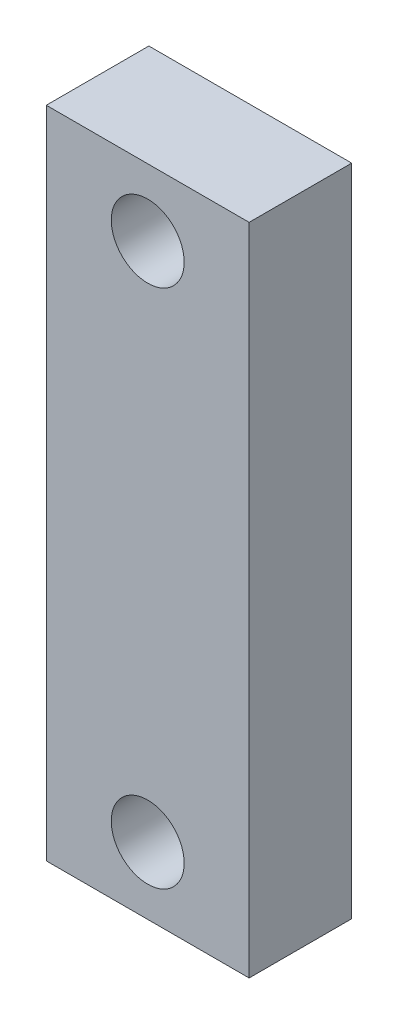
ISO-10303-21;
HEADER;
FILE_DESCRIPTION(('STEP AP214'),'2;1');
FILE_NAME('part.step','',(''),(''),'','','');
FILE_SCHEMA(('AUTOMOTIVE_DESIGN { 1 0 10303 214 1 1 1 1 }'));
ENDSEC;
DATA;
#1=APPLICATION_CONTEXT('core data for automotive mechanical design processes');
#2=APPLICATION_PROTOCOL_DEFINITION('international standard','automotive_design',2000,#1);
#3=PRODUCT_CONTEXT('',#1,'mechanical');
#4=PRODUCT('Part','Part','',(#3));
#5=PRODUCT_RELATED_PRODUCT_CATEGORY('part','',(#4));
#6=PRODUCT_DEFINITION_FORMATION('','',#4);
#7=PRODUCT_DEFINITION_CONTEXT('part definition',#1,'design');
#8=PRODUCT_DEFINITION('design','',#6,#7);
#9=PRODUCT_DEFINITION_SHAPE('','',#8);
#10=(LENGTH_UNIT() NAMED_UNIT(*) SI_UNIT(.MILLI.,.METRE.));
#11=(NAMED_UNIT(*) PLANE_ANGLE_UNIT() SI_UNIT($,.RADIAN.));
#12=(NAMED_UNIT(*) SI_UNIT($,.STERADIAN.) SOLID_ANGLE_UNIT());
#13=UNCERTAINTY_MEASURE_WITH_UNIT(LENGTH_MEASURE(1.E-05),#10,'distance_accuracy_value','');
#14=(GEOMETRIC_REPRESENTATION_CONTEXT(3) GLOBAL_UNCERTAINTY_ASSIGNED_CONTEXT((#13)) GLOBAL_UNIT_ASSIGNED_CONTEXT((#10,
#11,#12)) REPRESENTATION_CONTEXT('',''));
#15=CARTESIAN_POINT('',(0.,0.,0.));
#16=DIRECTION('',(0.,0.,1.));
#17=DIRECTION('',(1.,0.,0.));
#18=AXIS2_PLACEMENT_3D('',#15,#16,#17);
#19=CARTESIAN_POINT('',(0.,0.,13.4));
#20=DIRECTION('',(1.,0.,0.));
#21=DIRECTION('',(0.,0.,-1.));
#22=AXIS2_PLACEMENT_3D('',#19,#20,#21);
#23=PLANE('',#22);
#24=DIRECTION('',(0.,-1.,0.));
#25=VECTOR('',#24,1.);
#26=CARTESIAN_POINT('',(0.,0.,0.));
#27=LINE('',#26,#25);
#28=CARTESIAN_POINT('',(0.,85.5,0.));
#29=VERTEX_POINT('',#28);
#30=CARTESIAN_POINT('',(0.,0.,0.));
#31=VERTEX_POINT('',#30);
#32=EDGE_CURVE('E99',#29,#31,#27,.T.);
#33=ORIENTED_EDGE('',*,*,#32,.T.);
#34=DIRECTION('',(0.,0.,-1.));
#35=VECTOR('',#34,1.);
#36=CARTESIAN_POINT('',(0.,0.,13.4));
#37=LINE('',#36,#35);
#38=CARTESIAN_POINT('',(0.,0.,13.4));
#39=VERTEX_POINT('',#38);
#40=EDGE_CURVE('E11',#39,#31,#37,.T.);
#41=ORIENTED_EDGE('',*,*,#40,.F.);
#42=DIRECTION('',(0.,-1.,0.));
#43=VECTOR('',#42,1.);
#44=CARTESIAN_POINT('',(0.,0.,13.4));
#45=LINE('',#44,#43);
#46=CARTESIAN_POINT('',(0.,85.5,13.4));
#47=VERTEX_POINT('',#46);
#48=EDGE_CURVE('E87',#47,#39,#45,.T.);
#49=ORIENTED_EDGE('',*,*,#48,.F.);
#50=DIRECTION('',(0.,0.,-1.));
#51=VECTOR('',#50,1.);
#52=CARTESIAN_POINT('',(0.,85.5,13.4));
#53=LINE('',#52,#51);
#54=EDGE_CURVE('E95',#47,#29,#53,.T.);
#55=ORIENTED_EDGE('',*,*,#54,.T.);
#56=EDGE_LOOP('',(#33,#41,#49,#55));
#57=FACE_BOUND('',#56,.T.);
#58=ADVANCED_FACE('F36',(#57),#23,.F.);
#59=CARTESIAN_POINT('',(0.,0.,13.4));
#60=DIRECTION('',(0.,1.,0.));
#61=DIRECTION('',(0.,0.,1.));
#62=AXIS2_PLACEMENT_3D('',#59,#60,#61);
#63=PLANE('',#62);
#64=DIRECTION('',(1.,0.,0.));
#65=VECTOR('',#64,1.);
#66=CARTESIAN_POINT('',(0.,0.,0.));
#67=LINE('',#66,#65);
#68=CARTESIAN_POINT('',(26.5,0.,0.));
#69=VERTEX_POINT('',#68);
#70=EDGE_CURVE('E91',#31,#69,#67,.T.);
#71=ORIENTED_EDGE('',*,*,#70,.T.);
#72=DIRECTION('',(0.,0.,-1.));
#73=VECTOR('',#72,1.);
#74=CARTESIAN_POINT('',(26.5,0.,13.4));
#75=LINE('',#74,#73);
#76=CARTESIAN_POINT('',(26.5,0.,13.4));
#77=VERTEX_POINT('',#76);
#78=EDGE_CURVE('E44',#77,#69,#75,.T.);
#79=ORIENTED_EDGE('',*,*,#78,.F.);
#80=DIRECTION('',(1.,0.,0.));
#81=VECTOR('',#80,1.);
#82=CARTESIAN_POINT('',(0.,0.,13.4));
#83=LINE('',#82,#81);
#84=EDGE_CURVE('E82',#39,#77,#83,.T.);
#85=ORIENTED_EDGE('',*,*,#84,.F.);
#86=ORIENTED_EDGE('',*,*,#40,.T.);
#87=EDGE_LOOP('',(#71,#79,#85,#86));
#88=FACE_BOUND('',#87,.T.);
#89=ADVANCED_FACE('F90',(#88),#63,.F.);
#90=CARTESIAN_POINT('',(26.5,0.,13.4));
#91=DIRECTION('',(-1.,0.,0.));
#92=DIRECTION('',(0.,0.,1.));
#93=AXIS2_PLACEMENT_3D('',#90,#91,#92);
#94=PLANE('',#93);
#95=DIRECTION('',(0.,1.,0.));
#96=VECTOR('',#95,1.);
#97=CARTESIAN_POINT('',(26.5,0.,0.));
#98=LINE('',#97,#96);
#99=CARTESIAN_POINT('',(26.5,85.5,0.));
#100=VERTEX_POINT('',#99);
#101=EDGE_CURVE('E69',#69,#100,#98,.T.);
#102=ORIENTED_EDGE('',*,*,#101,.T.);
#103=DIRECTION('',(0.,0.,-1.));
#104=VECTOR('',#103,1.);
#105=CARTESIAN_POINT('',(26.5,85.5,13.4));
#106=LINE('',#105,#104);
#107=CARTESIAN_POINT('',(26.5,85.5,13.4));
#108=VERTEX_POINT('',#107);
#109=EDGE_CURVE('E92',#108,#100,#106,.T.);
#110=ORIENTED_EDGE('',*,*,#109,.F.);
#111=DIRECTION('',(0.,1.,0.));
#112=VECTOR('',#111,1.);
#113=CARTESIAN_POINT('',(26.5,0.,13.4));
#114=LINE('',#113,#112);
#115=EDGE_CURVE('E85',#77,#108,#114,.T.);
#116=ORIENTED_EDGE('',*,*,#115,.F.);
#117=ORIENTED_EDGE('',*,*,#78,.T.);
#118=EDGE_LOOP('',(#102,#110,#116,#117));
#119=FACE_BOUND('',#118,.T.);
#120=ADVANCED_FACE('F93',(#119),#94,.F.);
#121=CARTESIAN_POINT('',(0.,85.5,13.4));
#122=DIRECTION('',(0.,-1.,0.));
#123=DIRECTION('',(0.,0.,-1.));
#124=AXIS2_PLACEMENT_3D('',#121,#122,#123);
#125=PLANE('',#124);
#126=DIRECTION('',(-1.,0.,0.));
#127=VECTOR('',#126,1.);
#128=CARTESIAN_POINT('',(0.,85.5,0.));
#129=LINE('',#128,#127);
#130=EDGE_CURVE('E75',#100,#29,#129,.T.);
#131=ORIENTED_EDGE('',*,*,#130,.T.);
#132=ORIENTED_EDGE('',*,*,#54,.F.);
#133=DIRECTION('',(-1.,0.,0.));
#134=VECTOR('',#133,1.);
#135=CARTESIAN_POINT('',(0.,85.5,13.4));
#136=LINE('',#135,#134);
#137=EDGE_CURVE('E52',#108,#47,#136,.T.);
#138=ORIENTED_EDGE('',*,*,#137,.F.);
#139=ORIENTED_EDGE('',*,*,#109,.T.);
#140=EDGE_LOOP('',(#131,#132,#138,#139));
#141=FACE_BOUND('',#140,.T.);
#142=ADVANCED_FACE('F107',(#141),#125,.F.);
#143=CARTESIAN_POINT('',(0.,0.,13.4));
#144=DIRECTION('',(0.,0.,-1.));
#145=DIRECTION('',(-1.,0.,0.));
#146=AXIS2_PLACEMENT_3D('',#143,#144,#145);
#147=PLANE('',#146);
#148=CARTESIAN_POINT('',(13.25,8.75,13.4));
#149=DIRECTION('',(0.,0.,1.));
#150=DIRECTION('',(1.,0.,0.));
#151=AXIS2_PLACEMENT_3D('',#148,#149,#150);
#152=CIRCLE('',#151,4.7625);
#153=CARTESIAN_POINT('',(18.0125,8.75,13.4));
#154=VERTEX_POINT('',#153);
#155=EDGE_CURVE('E116',#154,#154,#152,.T.);
#156=ORIENTED_EDGE('',*,*,#155,.F.);
#157=EDGE_LOOP('',(#156));
#158=FACE_BOUND('',#157,.T.);
#159=CARTESIAN_POINT('',(13.25,76.75,13.4));
#160=DIRECTION('',(0.,0.,1.));
#161=DIRECTION('',(1.,0.,0.));
#162=AXIS2_PLACEMENT_3D('',#159,#160,#161);
#163=CIRCLE('',#162,4.7625);
#164=CARTESIAN_POINT('',(18.0125,76.75,13.4));
#165=VERTEX_POINT('',#164);
#166=EDGE_CURVE('E113',#165,#165,#163,.T.);
#167=ORIENTED_EDGE('',*,*,#166,.F.);
#168=EDGE_LOOP('',(#167));
#169=FACE_BOUND('',#168,.T.);
#170=ORIENTED_EDGE('',*,*,#48,.T.);
#171=ORIENTED_EDGE('',*,*,#84,.T.);
#172=ORIENTED_EDGE('',*,*,#115,.T.);
#173=ORIENTED_EDGE('',*,*,#137,.T.);
#174=EDGE_LOOP('',(#170,#171,#172,#173));
#175=FACE_BOUND('',#174,.T.);
#176=ADVANCED_FACE('F83',(#158,#169,#175),#147,.F.);
#177=CARTESIAN_POINT('',(0.,0.,0.));
#178=DIRECTION('',(0.,0.,-1.));
#179=DIRECTION('',(-1.,0.,0.));
#180=AXIS2_PLACEMENT_3D('',#177,#178,#179);
#181=PLANE('',#180);
#182=CARTESIAN_POINT('',(13.25,8.75,0.));
#183=DIRECTION('',(0.,0.,-1.));
#184=DIRECTION('',(-1.,0.,0.));
#185=AXIS2_PLACEMENT_3D('',#182,#183,#184);
#186=CIRCLE('',#185,4.7625);
#187=CARTESIAN_POINT('',(18.0125,8.75,0.));
#188=VERTEX_POINT('',#187);
#189=EDGE_CURVE('E102',#188,#188,#186,.F.);
#190=ORIENTED_EDGE('',*,*,#189,.T.);
#191=EDGE_LOOP('',(#190));
#192=FACE_BOUND('',#191,.T.);
#193=CARTESIAN_POINT('',(13.25,76.75,0.));
#194=DIRECTION('',(0.,0.,-1.));
#195=DIRECTION('',(-1.,0.,0.));
#196=AXIS2_PLACEMENT_3D('',#193,#194,#195);
#197=CIRCLE('',#196,4.7625);
#198=CARTESIAN_POINT('',(18.0125,76.75,0.));
#199=VERTEX_POINT('',#198);
#200=EDGE_CURVE('E117',#199,#199,#197,.F.);
#201=ORIENTED_EDGE('',*,*,#200,.T.);
#202=EDGE_LOOP('',(#201));
#203=FACE_BOUND('',#202,.T.);
#204=ORIENTED_EDGE('',*,*,#32,.F.);
#205=ORIENTED_EDGE('',*,*,#130,.F.);
#206=ORIENTED_EDGE('',*,*,#101,.F.);
#207=ORIENTED_EDGE('',*,*,#70,.F.);
#208=EDGE_LOOP('',(#204,#205,#206,#207));
#209=FACE_BOUND('',#208,.T.);
#210=ADVANCED_FACE('F110',(#192,#203,#209),#181,.T.);
#211=CARTESIAN_POINT('',(13.25,76.75,-13.4703841816037));
#212=DIRECTION('',(0.,0.,1.));
#213=DIRECTION('',(1.,0.,0.));
#214=AXIS2_PLACEMENT_3D('',#211,#212,#213);
#215=CYLINDRICAL_SURFACE('',#214,4.7625);
#216=CARTESIAN_POINT('',(18.0125,76.75,13.4));
#217=CARTESIAN_POINT('',(18.0125,76.75,13.2604166666667));
#218=CARTESIAN_POINT('',(18.0125,76.75,13.1208333333333));
#219=CARTESIAN_POINT('',(18.0125,76.75,12.8416666666667));
#220=CARTESIAN_POINT('',(18.0125,76.75,12.7020833333333));
#221=CARTESIAN_POINT('',(18.0125,76.75,12.4229166666667));
#222=CARTESIAN_POINT('',(18.0125,76.75,12.2833333333333));
#223=CARTESIAN_POINT('',(18.0125,76.75,12.0041666666667));
#224=CARTESIAN_POINT('',(18.0125,76.75,11.8645833333333));
#225=CARTESIAN_POINT('',(18.0125,76.75,11.5854166666667));
#226=CARTESIAN_POINT('',(18.0125,76.75,11.4458333333333));
#227=CARTESIAN_POINT('',(18.0125,76.75,11.1666666666667));
#228=CARTESIAN_POINT('',(18.0125,76.75,11.0270833333333));
#229=CARTESIAN_POINT('',(18.0125,76.75,10.7479166666667));
#230=CARTESIAN_POINT('',(18.0125,76.75,10.6083333333333));
#231=CARTESIAN_POINT('',(18.0125,76.75,10.3291666666667));
#232=CARTESIAN_POINT('',(18.0125,76.75,10.1895833333333));
#233=CARTESIAN_POINT('',(18.0125,76.75,9.91041666666666));
#234=CARTESIAN_POINT('',(18.0125,76.75,9.77083333333333));
#235=CARTESIAN_POINT('',(18.0125,76.75,9.49166666666666));
#236=CARTESIAN_POINT('',(18.0125,76.75,9.35208333333333));
#237=CARTESIAN_POINT('',(18.0125,76.75,9.07291666666666));
#238=CARTESIAN_POINT('',(18.0125,76.75,8.93333333333333));
#239=CARTESIAN_POINT('',(18.0125,76.75,8.65416666666667));
#240=CARTESIAN_POINT('',(18.0125,76.75,8.51458333333333));
#241=CARTESIAN_POINT('',(18.0125,76.75,8.23541666666666));
#242=CARTESIAN_POINT('',(18.0125,76.75,8.09583333333333));
#243=CARTESIAN_POINT('',(18.0125,76.75,7.81666666666666));
#244=CARTESIAN_POINT('',(18.0125,76.75,7.67708333333333));
#245=CARTESIAN_POINT('',(18.0125,76.75,7.39791666666666));
#246=CARTESIAN_POINT('',(18.0125,76.75,7.25833333333333));
#247=CARTESIAN_POINT('',(18.0125,76.75,6.97916666666667));
#248=CARTESIAN_POINT('',(18.0125,76.75,6.83958333333333));
#249=CARTESIAN_POINT('',(18.0125,76.75,6.56041666666667));
#250=CARTESIAN_POINT('',(18.0125,76.75,6.42083333333333));
#251=CARTESIAN_POINT('',(18.0125,76.75,6.14166666666666));
#252=CARTESIAN_POINT('',(18.0125,76.75,6.00208333333333));
#253=CARTESIAN_POINT('',(18.0125,76.75,5.72291666666667));
#254=CARTESIAN_POINT('',(18.0125,76.75,5.58333333333333));
#255=CARTESIAN_POINT('',(18.0125,76.75,5.30416666666666));
#256=CARTESIAN_POINT('',(18.0125,76.75,5.16458333333333));
#257=CARTESIAN_POINT('',(18.0125,76.75,4.88541666666666));
#258=CARTESIAN_POINT('',(18.0125,76.75,4.74583333333333));
#259=CARTESIAN_POINT('',(18.0125,76.75,4.46666666666667));
#260=CARTESIAN_POINT('',(18.0125,76.75,4.32708333333333));
#261=CARTESIAN_POINT('',(18.0125,76.75,4.04791666666666));
#262=CARTESIAN_POINT('',(18.0125,76.75,3.90833333333333));
#263=CARTESIAN_POINT('',(18.0125,76.75,3.62916666666666));
#264=CARTESIAN_POINT('',(18.0125,76.75,3.48958333333333));
#265=CARTESIAN_POINT('',(18.0125,76.75,3.21041666666666));
#266=CARTESIAN_POINT('',(18.0125,76.75,3.07083333333333));
#267=CARTESIAN_POINT('',(18.0125,76.75,2.79166666666666));
#268=CARTESIAN_POINT('',(18.0125,76.75,2.65208333333333));
#269=CARTESIAN_POINT('',(18.0125,76.75,2.37291666666666));
#270=CARTESIAN_POINT('',(18.0125,76.75,2.23333333333333));
#271=CARTESIAN_POINT('',(18.0125,76.75,1.95416666666667));
#272=CARTESIAN_POINT('',(18.0125,76.75,1.81458333333333));
#273=CARTESIAN_POINT('',(18.0125,76.75,1.53541666666667));
#274=CARTESIAN_POINT('',(18.0125,76.75,1.39583333333333));
#275=CARTESIAN_POINT('',(18.0125,76.75,1.11666666666667));
#276=CARTESIAN_POINT('',(18.0125,76.75,0.977083333333333));
#277=CARTESIAN_POINT('',(18.0125,76.75,0.697916666666667));
#278=CARTESIAN_POINT('',(18.0125,76.75,0.558333333333334));
#279=CARTESIAN_POINT('',(18.0125,76.75,0.279166666666667));
#280=CARTESIAN_POINT('',(18.0125,76.75,0.139583333333334));
#281=CARTESIAN_POINT('',(18.0125,76.75,0.));
#282=B_SPLINE_CURVE_WITH_KNOTS('',3,(#216,#217,#218,#219,#220,#221,#222,#223,#224,#225,#226,
#227,#228,#229,#230,#231,#232,#233,#234,#235,#236,#237,#238,#239,#240,#241,#242,#243,#244,#245,
#246,#247,#248,#249,#250,#251,#252,#253,#254,#255,#256,#257,#258,#259,#260,#261,#262,#263,#264,
#265,#266,#267,#268,#269,#270,#271,#272,#273,#274,#275,#276,#277,#278,#279,#280,#281),
.UNSPECIFIED.,.F.,.F.,(4,2,2,2,2,2,2,2,2,2,2,2,2,2,2,2,2,2,2,2,2,2,2,2,2,2,2,2,2,2,2,2,4),(0.,
0.418749999999999,0.837500000000001,1.25625,1.675,2.09375,2.5125,2.93125,3.35,3.76875,4.1875,
4.60625,5.025,5.44375,5.8625,6.28125,6.7,7.11875,7.5375,7.95625,8.375,8.79375,9.2125,9.63125,
10.05,10.46875,10.8875,11.30625,11.725,12.14375,12.5625,12.98125,13.4),.UNSPECIFIED.);
#283=EDGE_CURVE('BSEAM133',#165,#199,#282,.T.);
#284=ORIENTED_EDGE('',*,*,#166,.T.);
#285=ORIENTED_EDGE('',*,*,#200,.F.);
#286=ORIENTED_EDGE('',*,*,#283,.T.);
#287=ORIENTED_EDGE('',*,*,#283,.F.);
#288=EDGE_LOOP('',(#284,#286,#285,#287));
#289=FACE_BOUND('',#288,.T.);
#290=ADVANCED_FACE('F133',(#289),#215,.F.);
#291=CARTESIAN_POINT('',(13.25,8.75,-13.4703841816037));
#292=DIRECTION('',(0.,0.,1.));
#293=DIRECTION('',(1.,0.,0.));
#294=AXIS2_PLACEMENT_3D('',#291,#292,#293);
#295=CYLINDRICAL_SURFACE('',#294,4.7625);
#296=CARTESIAN_POINT('',(18.0125,8.75,13.4));
#297=CARTESIAN_POINT('',(18.0125,8.75,13.2604166666667));
#298=CARTESIAN_POINT('',(18.0125,8.75,13.1208333333333));
#299=CARTESIAN_POINT('',(18.0125,8.75,12.8416666666667));
#300=CARTESIAN_POINT('',(18.0125,8.75,12.7020833333333));
#301=CARTESIAN_POINT('',(18.0125,8.75,12.4229166666667));
#302=CARTESIAN_POINT('',(18.0125,8.75,12.2833333333333));
#303=CARTESIAN_POINT('',(18.0125,8.75,12.0041666666667));
#304=CARTESIAN_POINT('',(18.0125,8.75,11.8645833333333));
#305=CARTESIAN_POINT('',(18.0125,8.75,11.5854166666667));
#306=CARTESIAN_POINT('',(18.0125,8.75,11.4458333333333));
#307=CARTESIAN_POINT('',(18.0125,8.75,11.1666666666667));
#308=CARTESIAN_POINT('',(18.0125,8.75,11.0270833333333));
#309=CARTESIAN_POINT('',(18.0125,8.75,10.7479166666667));
#310=CARTESIAN_POINT('',(18.0125,8.75,10.6083333333333));
#311=CARTESIAN_POINT('',(18.0125,8.75,10.3291666666667));
#312=CARTESIAN_POINT('',(18.0125,8.75,10.1895833333333));
#313=CARTESIAN_POINT('',(18.0125,8.75,9.91041666666666));
#314=CARTESIAN_POINT('',(18.0125,8.75,9.77083333333333));
#315=CARTESIAN_POINT('',(18.0125,8.75,9.49166666666666));
#316=CARTESIAN_POINT('',(18.0125,8.75,9.35208333333333));
#317=CARTESIAN_POINT('',(18.0125,8.75,9.07291666666666));
#318=CARTESIAN_POINT('',(18.0125,8.75,8.93333333333333));
#319=CARTESIAN_POINT('',(18.0125,8.75,8.65416666666667));
#320=CARTESIAN_POINT('',(18.0125,8.75,8.51458333333333));
#321=CARTESIAN_POINT('',(18.0125,8.75,8.23541666666666));
#322=CARTESIAN_POINT('',(18.0125,8.75,8.09583333333333));
#323=CARTESIAN_POINT('',(18.0125,8.75,7.81666666666666));
#324=CARTESIAN_POINT('',(18.0125,8.75,7.67708333333333));
#325=CARTESIAN_POINT('',(18.0125,8.75,7.39791666666666));
#326=CARTESIAN_POINT('',(18.0125,8.75,7.25833333333333));
#327=CARTESIAN_POINT('',(18.0125,8.75,6.97916666666667));
#328=CARTESIAN_POINT('',(18.0125,8.75,6.83958333333333));
#329=CARTESIAN_POINT('',(18.0125,8.75,6.56041666666667));
#330=CARTESIAN_POINT('',(18.0125,8.75,6.42083333333333));
#331=CARTESIAN_POINT('',(18.0125,8.75,6.14166666666666));
#332=CARTESIAN_POINT('',(18.0125,8.75,6.00208333333333));
#333=CARTESIAN_POINT('',(18.0125,8.75,5.72291666666667));
#334=CARTESIAN_POINT('',(18.0125,8.75,5.58333333333333));
#335=CARTESIAN_POINT('',(18.0125,8.75,5.30416666666666));
#336=CARTESIAN_POINT('',(18.0125,8.75,5.16458333333333));
#337=CARTESIAN_POINT('',(18.0125,8.75,4.88541666666666));
#338=CARTESIAN_POINT('',(18.0125,8.75,4.74583333333333));
#339=CARTESIAN_POINT('',(18.0125,8.75,4.46666666666667));
#340=CARTESIAN_POINT('',(18.0125,8.75,4.32708333333333));
#341=CARTESIAN_POINT('',(18.0125,8.75,4.04791666666666));
#342=CARTESIAN_POINT('',(18.0125,8.75,3.90833333333333));
#343=CARTESIAN_POINT('',(18.0125,8.75,3.62916666666666));
#344=CARTESIAN_POINT('',(18.0125,8.75,3.48958333333333));
#345=CARTESIAN_POINT('',(18.0125,8.75,3.21041666666666));
#346=CARTESIAN_POINT('',(18.0125,8.75,3.07083333333333));
#347=CARTESIAN_POINT('',(18.0125,8.75,2.79166666666666));
#348=CARTESIAN_POINT('',(18.0125,8.75,2.65208333333333));
#349=CARTESIAN_POINT('',(18.0125,8.75,2.37291666666666));
#350=CARTESIAN_POINT('',(18.0125,8.75,2.23333333333333));
#351=CARTESIAN_POINT('',(18.0125,8.75,1.95416666666667));
#352=CARTESIAN_POINT('',(18.0125,8.75,1.81458333333333));
#353=CARTESIAN_POINT('',(18.0125,8.75,1.53541666666667));
#354=CARTESIAN_POINT('',(18.0125,8.75,1.39583333333333));
#355=CARTESIAN_POINT('',(18.0125,8.75,1.11666666666667));
#356=CARTESIAN_POINT('',(18.0125,8.75,0.977083333333333));
#357=CARTESIAN_POINT('',(18.0125,8.75,0.697916666666667));
#358=CARTESIAN_POINT('',(18.0125,8.75,0.558333333333334));
#359=CARTESIAN_POINT('',(18.0125,8.75,0.279166666666667));
#360=CARTESIAN_POINT('',(18.0125,8.75,0.139583333333334));
#361=CARTESIAN_POINT('',(18.0125,8.75,0.));
#362=B_SPLINE_CURVE_WITH_KNOTS('',3,(#296,#297,#298,#299,#300,#301,#302,#303,#304,#305,#306,
#307,#308,#309,#310,#311,#312,#313,#314,#315,#316,#317,#318,#319,#320,#321,#322,#323,#324,#325,
#326,#327,#328,#329,#330,#331,#332,#333,#334,#335,#336,#337,#338,#339,#340,#341,#342,#343,#344,
#345,#346,#347,#348,#349,#350,#351,#352,#353,#354,#355,#356,#357,#358,#359,#360,#361),
.UNSPECIFIED.,.F.,.F.,(4,2,2,2,2,2,2,2,2,2,2,2,2,2,2,2,2,2,2,2,2,2,2,2,2,2,2,2,2,2,2,2,4),(0.,
0.418749999999999,0.837500000000001,1.25625,1.675,2.09375,2.5125,2.93125,3.35,3.76875,4.1875,
4.60625,5.025,5.44375,5.8625,6.28125,6.7,7.11875,7.5375,7.95625,8.375,8.79375,9.2125,9.63125,
10.05,10.46875,10.8875,11.30625,11.725,12.14375,12.5625,12.98125,13.4),.UNSPECIFIED.);
#363=EDGE_CURVE('BSEAM125',#154,#188,#362,.T.);
#364=ORIENTED_EDGE('',*,*,#155,.T.);
#365=ORIENTED_EDGE('',*,*,#189,.F.);
#366=ORIENTED_EDGE('',*,*,#363,.T.);
#367=ORIENTED_EDGE('',*,*,#363,.F.);
#368=EDGE_LOOP('',(#364,#366,#365,#367));
#369=FACE_BOUND('',#368,.T.);
#370=ADVANCED_FACE('F125',(#369),#295,.F.);
#371=CLOSED_SHELL('',(#58,#89,#120,#142,#176,#210,#290,#370));
#372=MANIFOLD_SOLID_BREP('B2',#371);
#373=ADVANCED_BREP_SHAPE_REPRESENTATION('',(#18,#372),#14);
#374=SHAPE_DEFINITION_REPRESENTATION(#9,#373);
ENDSEC;
END-ISO-10303-21;
